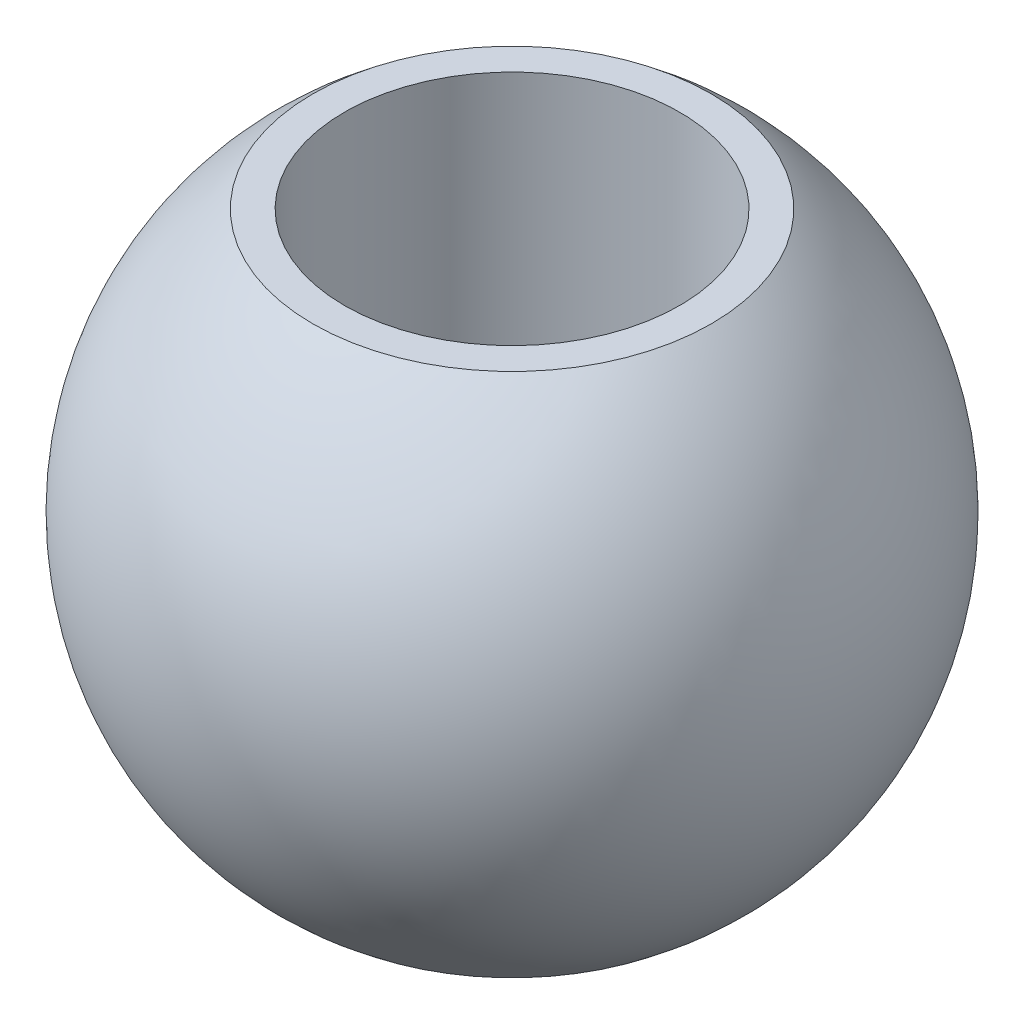
ISO-10303-21;
HEADER;
FILE_DESCRIPTION(('STEP AP214'),'2;1');
FILE_NAME('part.step','',(''),(''),'','','');
FILE_SCHEMA(('AUTOMOTIVE_DESIGN { 1 0 10303 214 1 1 1 1 }'));
ENDSEC;
DATA;
#1=APPLICATION_CONTEXT('core data for automotive mechanical design processes');
#2=APPLICATION_PROTOCOL_DEFINITION('international standard','automotive_design',2000,#1);
#3=PRODUCT_CONTEXT('',#1,'mechanical');
#4=PRODUCT('Part','Part','',(#3));
#5=PRODUCT_RELATED_PRODUCT_CATEGORY('part','',(#4));
#6=PRODUCT_DEFINITION_FORMATION('','',#4);
#7=PRODUCT_DEFINITION_CONTEXT('part definition',#1,'design');
#8=PRODUCT_DEFINITION('design','',#6,#7);
#9=PRODUCT_DEFINITION_SHAPE('','',#8);
#10=(LENGTH_UNIT() NAMED_UNIT(*) SI_UNIT(.MILLI.,.METRE.));
#11=(NAMED_UNIT(*) PLANE_ANGLE_UNIT() SI_UNIT($,.RADIAN.));
#12=(NAMED_UNIT(*) SI_UNIT($,.STERADIAN.) SOLID_ANGLE_UNIT());
#13=UNCERTAINTY_MEASURE_WITH_UNIT(LENGTH_MEASURE(1.E-05),#10,'distance_accuracy_value','');
#14=(GEOMETRIC_REPRESENTATION_CONTEXT(3) GLOBAL_UNCERTAINTY_ASSIGNED_CONTEXT((#13)) GLOBAL_UNIT_ASSIGNED_CONTEXT((#10,
#11,#12)) REPRESENTATION_CONTEXT('',''));
#15=CARTESIAN_POINT('',(0.,0.,0.));
#16=DIRECTION('',(0.,0.,1.));
#17=DIRECTION('',(1.,0.,0.));
#18=AXIS2_PLACEMENT_3D('',#15,#16,#17);
#19=CARTESIAN_POINT('',(0.,2.35,0.));
#20=DIRECTION('',(0.,-1.,0.));
#21=DIRECTION('',(0.,0.,-1.));
#22=AXIS2_PLACEMENT_3D('',#19,#20,#21);
#23=PLANE('',#22);
#24=CARTESIAN_POINT('',(0.,2.35,0.));
#25=DIRECTION('',(0.,1.,0.));
#26=DIRECTION('',(0.,0.,1.));
#27=AXIS2_PLACEMENT_3D('',#24,#25,#26);
#28=CIRCLE('',#27,1.5);
#29=CARTESIAN_POINT('',(0.,2.35,1.5));
#30=VERTEX_POINT('',#29);
#31=EDGE_CURVE('E53',#30,#30,#28,.T.);
#32=ORIENTED_EDGE('',*,*,#31,.F.);
#33=EDGE_LOOP('',(#32));
#34=FACE_BOUND('',#33,.T.);
#35=CARTESIAN_POINT('',(0.,2.35,0.));
#36=DIRECTION('',(0.,1.,0.));
#37=DIRECTION('',(0.,0.,1.));
#38=AXIS2_PLACEMENT_3D('',#35,#36,#37);
#39=CIRCLE('',#38,1.7832554500127);
#40=CARTESIAN_POINT('',(1.7832554500127,2.35,0.));
#41=VERTEX_POINT('',#40);
#42=EDGE_CURVE('E45',#41,#41,#39,.T.);
#43=ORIENTED_EDGE('',*,*,#42,.T.);
#44=EDGE_LOOP('',(#43));
#45=FACE_BOUND('',#44,.T.);
#46=ADVANCED_FACE('F39',(#34,#45),#23,.F.);
#47=CARTESIAN_POINT('',(0.,-2.35,0.));
#48=DIRECTION('',(0.,1.,0.));
#49=DIRECTION('',(0.,0.,1.));
#50=AXIS2_PLACEMENT_3D('',#47,#48,#49);
#51=PLANE('',#50);
#52=CARTESIAN_POINT('',(0.,-2.35,0.));
#53=DIRECTION('',(0.,1.,0.));
#54=DIRECTION('',(0.,0.,1.));
#55=AXIS2_PLACEMENT_3D('',#52,#53,#54);
#56=CIRCLE('',#55,1.5);
#57=CARTESIAN_POINT('',(0.,-2.35,1.5));
#58=VERTEX_POINT('',#57);
#59=EDGE_CURVE('E49',#58,#58,#56,.F.);
#60=ORIENTED_EDGE('',*,*,#59,.F.);
#61=EDGE_LOOP('',(#60));
#62=FACE_BOUND('',#61,.T.);
#63=CARTESIAN_POINT('',(0.,-2.35,0.));
#64=DIRECTION('',(0.,1.,0.));
#65=DIRECTION('',(0.,0.,1.));
#66=AXIS2_PLACEMENT_3D('',#63,#64,#65);
#67=CIRCLE('',#66,1.7832554500127);
#68=CARTESIAN_POINT('',(1.7832554500127,-2.35,0.));
#69=VERTEX_POINT('',#68);
#70=EDGE_CURVE('E10',#69,#69,#67,.T.);
#71=ORIENTED_EDGE('',*,*,#70,.F.);
#72=EDGE_LOOP('',(#71));
#73=FACE_BOUND('',#72,.T.);
#74=ADVANCED_FACE('F62',(#62,#73),#51,.F.);
#75=CARTESIAN_POINT('',(0.,0.,0.));
#76=DIRECTION('',(0.,1.,0.));
#77=DIRECTION('',(1.,0.,0.));
#78=AXIS2_PLACEMENT_3D('',#75,#76,#77);
#79=SPHERICAL_SURFACE('',#78,2.95);
#80=CARTESIAN_POINT('',(1.7832554500127,2.35,0.));
#81=CARTESIAN_POINT('',(1.82837996988595,2.31576050197127,0.));
#82=CARTESIAN_POINT('',(1.87251581901192,2.28021843993881,0.));
#83=CARTESIAN_POINT('',(1.95866930480193,2.20665358264746,0.));
#84=CARTESIAN_POINT('',(2.00068694146598,2.16863078738856,0.));
#85=CARTESIAN_POINT('',(2.08246313136479,2.09022885842534,0.));
#86=CARTESIAN_POINT('',(2.12222168459955,2.04984972472102,0.));
#87=CARTESIAN_POINT('',(2.19934821360311,1.96686953544002,0.));
#88=CARTESIAN_POINT('',(2.2367161893719,1.92426847986336,0.));
#89=CARTESIAN_POINT('',(2.30893749522107,1.83698564339743,0.));
#90=CARTESIAN_POINT('',(2.34379082530145,1.79230386250818,0.));
#91=CARTESIAN_POINT('',(2.41086724862148,1.70100783272881,0.));
#92=CARTESIAN_POINT('',(2.44309034186115,1.65439358383869,0.));
#93=CARTESIAN_POINT('',(2.50479938946851,1.55938724356733,0.));
#94=CARTESIAN_POINT('',(2.53428534383621,1.51099515218608,0.));
#95=CARTESIAN_POINT('',(2.59042230134499,1.41259366148478,0.));
#96=CARTESIAN_POINT('',(2.61707330448606,1.36258426216473,0.));
#97=CARTESIAN_POINT('',(2.66745194903246,1.26111405222377,0.));
#98=CARTESIAN_POINT('',(2.69117959043778,1.20965324160284,0.));
#99=CARTESIAN_POINT('',(2.73563279943261,1.10545092131278,0.));
#100=CARTESIAN_POINT('',(2.75635836702213,1.05270941164364,0.));
#101=CARTESIAN_POINT('',(2.79473867496419,0.94612065378231,0.));
#102=CARTESIAN_POINT('',(2.81239341531672,0.892273405590112,0.));
#103=CARTESIAN_POINT('',(2.84457350233646,0.783651799357147,0.));
#104=CARTESIAN_POINT('',(2.85909884900366,0.728877441316379,0.));
#105=CARTESIAN_POINT('',(2.88497196339756,0.618583319566984,0.));
#106=CARTESIAN_POINT('',(2.89631973112426,0.563063555858356,0.));
#107=CARTESIAN_POINT('',(2.91580004343817,0.451462799708789,0.));
#108=CARTESIAN_POINT('',(2.92393258802538,0.39538180726785,0.));
#109=CARTESIAN_POINT('',(2.93695547579086,0.282844632364516,0.));
#110=CARTESIAN_POINT('',(2.94184581896914,0.226388449902122,0.));
#111=CARTESIAN_POINT('',(2.94836808107371,0.113288178293151,0.));
#112=CARTESIAN_POINT('',(2.95,0.0566440891465751,0.));
#113=CARTESIAN_POINT('',(2.95,-0.0566440891465764,0.));
#114=CARTESIAN_POINT('',(2.94836808107371,-0.113288178293152,0.));
#115=CARTESIAN_POINT('',(2.94184581896914,-0.226388449902123,0.));
#116=CARTESIAN_POINT('',(2.93695547579086,-0.282844632364518,0.));
#117=CARTESIAN_POINT('',(2.92393258802538,-0.395381807267851,0.));
#118=CARTESIAN_POINT('',(2.91580004343817,-0.45146279970879,0.));
#119=CARTESIAN_POINT('',(2.89631973112426,-0.563063555858357,0.));
#120=CARTESIAN_POINT('',(2.88497196339756,-0.618583319566985,0.));
#121=CARTESIAN_POINT('',(2.85909884900366,-0.728877441316381,0.));
#122=CARTESIAN_POINT('',(2.84457350233646,-0.783651799357148,0.));
#123=CARTESIAN_POINT('',(2.81239341531672,-0.892273405590113,0.));
#124=CARTESIAN_POINT('',(2.79473867496419,-0.946120653782311,0.));
#125=CARTESIAN_POINT('',(2.75635836702213,-1.05270941164365,0.));
#126=CARTESIAN_POINT('',(2.73563279943261,-1.10545092131278,0.));
#127=CARTESIAN_POINT('',(2.69117959043777,-1.20965324160284,0.));
#128=CARTESIAN_POINT('',(2.66745194903246,-1.26111405222377,0.));
#129=CARTESIAN_POINT('',(2.61707330448606,-1.36258426216474,0.));
#130=CARTESIAN_POINT('',(2.59042230134499,-1.41259366148478,0.));
#131=CARTESIAN_POINT('',(2.53428534383621,-1.51099515218608,0.));
#132=CARTESIAN_POINT('',(2.50479938946851,-1.55938724356733,0.));
#133=CARTESIAN_POINT('',(2.44309034186115,-1.65439358383869,0.));
#134=CARTESIAN_POINT('',(2.41086724862148,-1.70100783272881,0.));
#135=CARTESIAN_POINT('',(2.34379082530145,-1.79230386250818,0.));
#136=CARTESIAN_POINT('',(2.30893749522107,-1.83698564339744,0.));
#137=CARTESIAN_POINT('',(2.2367161893719,-1.92426847986336,0.));
#138=CARTESIAN_POINT('',(2.19934821360311,-1.96686953544003,0.));
#139=CARTESIAN_POINT('',(2.12222168459955,-2.04984972472102,0.));
#140=CARTESIAN_POINT('',(2.08246313136479,-2.09022885842534,0.));
#141=CARTESIAN_POINT('',(2.00068694146598,-2.16863078738856,0.));
#142=CARTESIAN_POINT('',(1.95866930480193,-2.20665358264746,0.));
#143=CARTESIAN_POINT('',(1.87251581901192,-2.28021843993882,0.));
#144=CARTESIAN_POINT('',(1.82837996988595,-2.31576050197127,0.));
#145=CARTESIAN_POINT('',(1.7832554500127,-2.35,0.));
#146=B_SPLINE_CURVE_WITH_KNOTS('',3,(#80,#81,#82,#83,#84,#85,#86,#87,#88,#89,#90,#91,#92,#93,
#94,#95,#96,#97,#98,#99,#100,#101,#102,#103,#104,#105,#106,#107,#108,#109,#110,#111,#112,#113,
#114,#115,#116,#117,#118,#119,#120,#121,#122,#123,#124,#125,#126,#127,#128,#129,#130,#131,#132,
#133,#134,#135,#136,#137,#138,#139,#140,#141,#142,#143,#144,#145),.UNSPECIFIED.,.F.,.F.,(4,2,2,
2,2,2,2,2,2,2,2,2,2,2,2,2,2,2,2,2,2,2,2,2,2,2,2,2,2,2,2,2,4),(0.,0.169908783980171,
0.339817567960342,0.509726351940513,0.679635135920684,0.849543919900855,1.01945270388103,
1.1893614878612,1.35927027184137,1.52917905582154,1.69908783980171,1.86899662378188,
2.03890540776205,2.20881419174222,2.37872297572239,2.54863175970257,2.71854054368274,
2.88844932766291,3.05835811164308,3.22826689562325,3.39817567960342,3.56808446358359,
3.73799324756376,3.90790203154393,4.07781081552411,4.24771959950428,4.41762838348445,
4.58753716746462,4.75744595144479,4.92735473542496,5.09726351940513,5.2671723033853,
5.43708108736547),.UNSPECIFIED.);
#147=EDGE_CURVE('BSEAM67',#41,#69,#146,.T.);
#148=ORIENTED_EDGE('',*,*,#42,.F.);
#149=ORIENTED_EDGE('',*,*,#70,.T.);
#150=ORIENTED_EDGE('',*,*,#147,.T.);
#151=ORIENTED_EDGE('',*,*,#147,.F.);
#152=EDGE_LOOP('',(#148,#150,#149,#151));
#153=FACE_BOUND('',#152,.T.);
#154=ADVANCED_FACE('F67',(#153),#79,.T.);
#155=CARTESIAN_POINT('',(0.,-6.59264068711929,0.));
#156=DIRECTION('',(0.,1.,0.));
#157=DIRECTION('',(0.,0.,1.));
#158=AXIS2_PLACEMENT_3D('',#155,#156,#157);
#159=CYLINDRICAL_SURFACE('',#158,1.5);
#160=ORIENTED_EDGE('',*,*,#59,.T.);
#161=EDGE_LOOP('',(#160));
#162=FACE_BOUND('',#161,.T.);
#163=ORIENTED_EDGE('',*,*,#31,.T.);
#164=EDGE_LOOP('',(#163));
#165=FACE_BOUND('',#164,.T.);
#166=ADVANCED_FACE('F59',(#162,#165),#159,.F.);
#167=CLOSED_SHELL('',(#46,#74,#154,#166));
#168=MANIFOLD_SOLID_BREP('B2',#167);
#169=ADVANCED_BREP_SHAPE_REPRESENTATION('',(#18,#168),#14);
#170=SHAPE_DEFINITION_REPRESENTATION(#9,#169);
ENDSEC;
END-ISO-10303-21;
